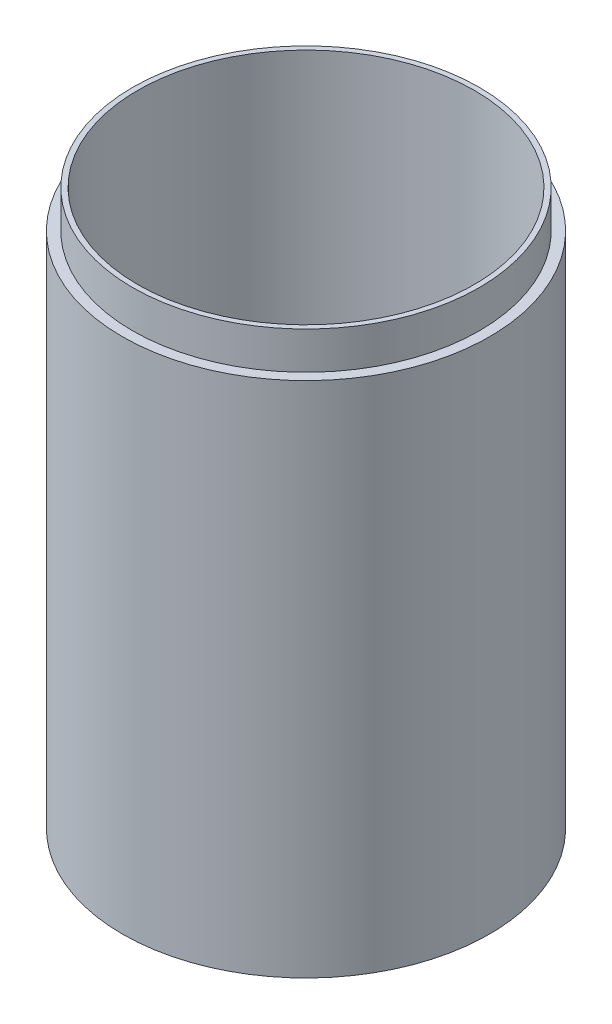
ISO-10303-21;
HEADER;
FILE_DESCRIPTION(('STEP AP214'),'2;1');
FILE_NAME('part.step','',(''),(''),'','','');
FILE_SCHEMA(('AUTOMOTIVE_DESIGN { 1 0 10303 214 1 1 1 1 }'));
ENDSEC;
DATA;
#1=APPLICATION_CONTEXT('core data for automotive mechanical design processes');
#2=APPLICATION_PROTOCOL_DEFINITION('international standard','automotive_design',2000,#1);
#3=PRODUCT_CONTEXT('',#1,'mechanical');
#4=PRODUCT('Part','Part','',(#3));
#5=PRODUCT_RELATED_PRODUCT_CATEGORY('part','',(#4));
#6=PRODUCT_DEFINITION_FORMATION('','',#4);
#7=PRODUCT_DEFINITION_CONTEXT('part definition',#1,'design');
#8=PRODUCT_DEFINITION('design','',#6,#7);
#9=PRODUCT_DEFINITION_SHAPE('','',#8);
#10=(LENGTH_UNIT() NAMED_UNIT(*) SI_UNIT(.MILLI.,.METRE.));
#11=(NAMED_UNIT(*) PLANE_ANGLE_UNIT() SI_UNIT($,.RADIAN.));
#12=(NAMED_UNIT(*) SI_UNIT($,.STERADIAN.) SOLID_ANGLE_UNIT());
#13=UNCERTAINTY_MEASURE_WITH_UNIT(LENGTH_MEASURE(1.E-05),#10,'distance_accuracy_value','');
#14=(GEOMETRIC_REPRESENTATION_CONTEXT(3) GLOBAL_UNCERTAINTY_ASSIGNED_CONTEXT((#13)) GLOBAL_UNIT_ASSIGNED_CONTEXT((#10,
#11,#12)) REPRESENTATION_CONTEXT('',''));
#15=CARTESIAN_POINT('',(0.,0.,0.));
#16=DIRECTION('',(0.,0.,1.));
#17=DIRECTION('',(1.,0.,0.));
#18=AXIS2_PLACEMENT_3D('',#15,#16,#17);
#19=CARTESIAN_POINT('',(0.,33.2676701737178,0.));
#20=DIRECTION('',(0.,1.,0.));
#21=DIRECTION('',(0.,0.,1.));
#22=AXIS2_PLACEMENT_3D('',#19,#20,#21);
#23=CYLINDRICAL_SURFACE('',#22,22.86);
#24=CARTESIAN_POINT('',(0.,0.,0.));
#25=DIRECTION('',(0.,1.,0.));
#26=DIRECTION('',(0.,0.,1.));
#27=AXIS2_PLACEMENT_3D('',#24,#25,#26);
#28=CIRCLE('',#27,22.86);
#29=CARTESIAN_POINT('',(0.,0.,22.86));
#30=VERTEX_POINT('',#29);
#31=EDGE_CURVE('E10',#30,#30,#28,.T.);
#32=ORIENTED_EDGE('',*,*,#31,.F.);
#33=EDGE_LOOP('',(#32));
#34=FACE_BOUND('',#33,.T.);
#35=CARTESIAN_POINT('',(0.,-64.42075,0.));
#36=DIRECTION('',(0.,1.,0.));
#37=DIRECTION('',(0.,0.,1.));
#38=AXIS2_PLACEMENT_3D('',#35,#36,#37);
#39=CIRCLE('',#38,22.86);
#40=CARTESIAN_POINT('',(0.,-64.42075,22.86));
#41=VERTEX_POINT('',#40);
#42=EDGE_CURVE('E43',#41,#41,#39,.T.);
#43=ORIENTED_EDGE('',*,*,#42,.T.);
#44=EDGE_LOOP('',(#43));
#45=FACE_BOUND('',#44,.T.);
#46=ADVANCED_FACE('F36',(#34,#45),#23,.T.);
#47=CARTESIAN_POINT('',(22.86,-64.42075,0.));
#48=DIRECTION('',(0.,1.,0.));
#49=DIRECTION('',(0.,0.,1.));
#50=AXIS2_PLACEMENT_3D('',#47,#48,#49);
#51=PLANE('',#50);
#52=ORIENTED_EDGE('',*,*,#42,.F.);
#53=EDGE_LOOP('',(#52));
#54=FACE_BOUND('',#53,.T.);
#55=ADVANCED_FACE('F73',(#54),#51,.F.);
#56=CARTESIAN_POINT('',(0.,33.2676701737178,0.));
#57=DIRECTION('',(0.,1.,0.));
#58=DIRECTION('',(0.,0.,1.));
#59=AXIS2_PLACEMENT_3D('',#56,#57,#58);
#60=CYLINDRICAL_SURFACE('',#59,21.59);
#61=CARTESIAN_POINT('',(0.,0.,0.));
#62=DIRECTION('',(0.,1.,0.));
#63=DIRECTION('',(0.,0.,1.));
#64=AXIS2_PLACEMENT_3D('',#61,#62,#63);
#65=CIRCLE('',#64,21.59);
#66=CARTESIAN_POINT('',(0.,0.,21.59));
#67=VERTEX_POINT('',#66);
#68=EDGE_CURVE('E60',#67,#67,#65,.T.);
#69=ORIENTED_EDGE('',*,*,#68,.T.);
#70=EDGE_LOOP('',(#69));
#71=FACE_BOUND('',#70,.T.);
#72=CARTESIAN_POINT('',(0.,4.66725,0.));
#73=DIRECTION('',(0.,1.,0.));
#74=DIRECTION('',(0.,0.,1.));
#75=AXIS2_PLACEMENT_3D('',#72,#73,#74);
#76=CIRCLE('',#75,21.59);
#77=CARTESIAN_POINT('',(0.,4.66725,21.59));
#78=VERTEX_POINT('',#77);
#79=EDGE_CURVE('E63',#78,#78,#76,.T.);
#80=ORIENTED_EDGE('',*,*,#79,.F.);
#81=EDGE_LOOP('',(#80));
#82=FACE_BOUND('',#81,.T.);
#83=ADVANCED_FACE('F70',(#71,#82),#60,.T.);
#84=CARTESIAN_POINT('',(21.59,0.,0.));
#85=DIRECTION('',(0.,-1.,0.));
#86=DIRECTION('',(0.,0.,-1.));
#87=AXIS2_PLACEMENT_3D('',#84,#85,#86);
#88=PLANE('',#87);
#89=ORIENTED_EDGE('',*,*,#68,.F.);
#90=EDGE_LOOP('',(#89));
#91=FACE_BOUND('',#90,.T.);
#92=ORIENTED_EDGE('',*,*,#31,.T.);
#93=EDGE_LOOP('',(#92));
#94=FACE_BOUND('',#93,.T.);
#95=ADVANCED_FACE('F72',(#91,#94),#88,.F.);
#96=CARTESIAN_POINT('',(0.,-62.89675,0.));
#97=DIRECTION('',(0.,-1.,0.));
#98=DIRECTION('',(0.,0.,-1.));
#99=AXIS2_PLACEMENT_3D('',#96,#97,#98);
#100=PLANE('',#99);
#101=CARTESIAN_POINT('',(0.,-62.89675,0.));
#102=DIRECTION('',(0.,1.,0.));
#103=DIRECTION('',(0.,0.,1.));
#104=AXIS2_PLACEMENT_3D('',#101,#102,#103);
#105=CIRCLE('',#104,20.955);
#106=CARTESIAN_POINT('',(0.,-62.89675,20.955));
#107=VERTEX_POINT('',#106);
#108=EDGE_CURVE('E50',#107,#107,#105,.T.);
#109=ORIENTED_EDGE('',*,*,#108,.T.);
#110=EDGE_LOOP('',(#109));
#111=FACE_BOUND('',#110,.T.);
#112=ADVANCED_FACE('F80',(#111),#100,.F.);
#113=CARTESIAN_POINT('',(0.,33.2676701737178,0.));
#114=DIRECTION('',(0.,1.,0.));
#115=DIRECTION('',(0.,0.,1.));
#116=AXIS2_PLACEMENT_3D('',#113,#114,#115);
#117=CYLINDRICAL_SURFACE('',#116,20.955);
#118=ORIENTED_EDGE('',*,*,#108,.F.);
#119=EDGE_LOOP('',(#118));
#120=FACE_BOUND('',#119,.T.);
#121=CARTESIAN_POINT('',(0.,4.66725,0.));
#122=DIRECTION('',(0.,1.,0.));
#123=DIRECTION('',(0.,0.,1.));
#124=AXIS2_PLACEMENT_3D('',#121,#122,#123);
#125=CIRCLE('',#124,20.955);
#126=CARTESIAN_POINT('',(0.,4.66725,20.955));
#127=VERTEX_POINT('',#126);
#128=EDGE_CURVE('E55',#127,#127,#125,.T.);
#129=ORIENTED_EDGE('',*,*,#128,.T.);
#130=EDGE_LOOP('',(#129));
#131=FACE_BOUND('',#130,.T.);
#132=ADVANCED_FACE('F100',(#120,#131),#117,.F.);
#133=CARTESIAN_POINT('',(20.955,4.66725,0.));
#134=DIRECTION('',(0.,-1.,0.));
#135=DIRECTION('',(0.,0.,-1.));
#136=AXIS2_PLACEMENT_3D('',#133,#134,#135);
#137=PLANE('',#136);
#138=ORIENTED_EDGE('',*,*,#128,.F.);
#139=EDGE_LOOP('',(#138));
#140=FACE_BOUND('',#139,.T.);
#141=ORIENTED_EDGE('',*,*,#79,.T.);
#142=EDGE_LOOP('',(#141));
#143=FACE_BOUND('',#142,.T.);
#144=ADVANCED_FACE('F68',(#140,#143),#137,.F.);
#145=CLOSED_SHELL('',(#46,#55,#83,#95,#112,#132,#144));
#146=MANIFOLD_SOLID_BREP('B2',#145);
#147=ADVANCED_BREP_SHAPE_REPRESENTATION('',(#18,#146),#14);
#148=SHAPE_DEFINITION_REPRESENTATION(#9,#147);
ENDSEC;
END-ISO-10303-21;
